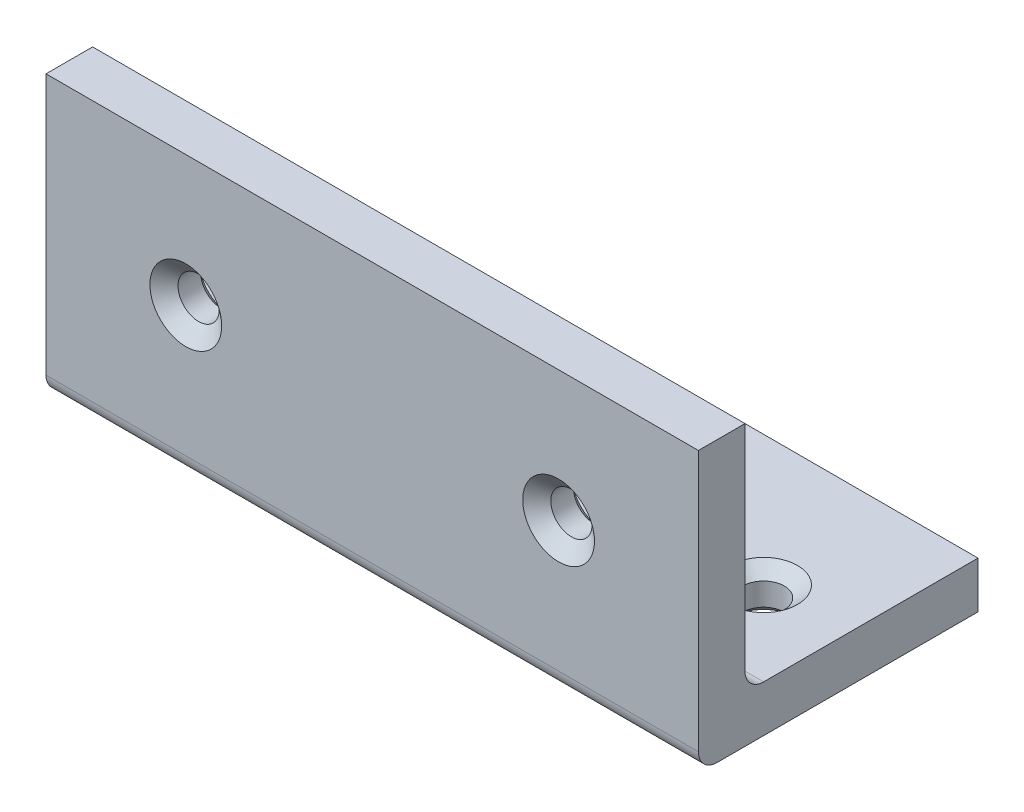
ISO-10303-21;
HEADER;
FILE_DESCRIPTION(('STEP AP214'),'2;1');
FILE_NAME('part.step','',(''),(''),'','','');
FILE_SCHEMA(('AUTOMOTIVE_DESIGN { 1 0 10303 214 1 1 1 1 }'));
ENDSEC;
DATA;
#1=APPLICATION_CONTEXT('core data for automotive mechanical design processes');
#2=APPLICATION_PROTOCOL_DEFINITION('international standard','automotive_design',2000,#1);
#3=PRODUCT_CONTEXT('',#1,'mechanical');
#4=PRODUCT('Part','Part','',(#3));
#5=PRODUCT_RELATED_PRODUCT_CATEGORY('part','',(#4));
#6=PRODUCT_DEFINITION_FORMATION('','',#4);
#7=PRODUCT_DEFINITION_CONTEXT('part definition',#1,'design');
#8=PRODUCT_DEFINITION('design','',#6,#7);
#9=PRODUCT_DEFINITION_SHAPE('','',#8);
#10=(LENGTH_UNIT() NAMED_UNIT(*) SI_UNIT(.MILLI.,.METRE.));
#11=(NAMED_UNIT(*) PLANE_ANGLE_UNIT() SI_UNIT($,.RADIAN.));
#12=(NAMED_UNIT(*) SI_UNIT($,.STERADIAN.) SOLID_ANGLE_UNIT());
#13=UNCERTAINTY_MEASURE_WITH_UNIT(LENGTH_MEASURE(1.E-05),#10,'distance_accuracy_value','');
#14=(GEOMETRIC_REPRESENTATION_CONTEXT(3) GLOBAL_UNCERTAINTY_ASSIGNED_CONTEXT((#13)) GLOBAL_UNIT_ASSIGNED_CONTEXT((#10,
#11,#12)) REPRESENTATION_CONTEXT('',''));
#15=CARTESIAN_POINT('',(0.,0.,0.));
#16=DIRECTION('',(0.,0.,1.));
#17=DIRECTION('',(1.,0.,0.));
#18=AXIS2_PLACEMENT_3D('',#15,#16,#17);
#19=CARTESIAN_POINT('',(0.,6.35,0.));
#20=DIRECTION('',(0.,-1.,0.));
#21=DIRECTION('',(0.,0.,-1.));
#22=AXIS2_PLACEMENT_3D('',#19,#20,#21);
#23=PLANE('',#22);
#24=CARTESIAN_POINT('',(33.02,6.35,-1.27000000000001));
#25=DIRECTION('',(0.,-1.,0.));
#26=DIRECTION('',(0.,0.,-1.));
#27=AXIS2_PLACEMENT_3D('',#24,#25,#26);
#28=CIRCLE('',#27,4.6101);
#29=CARTESIAN_POINT('',(33.02,6.35,-5.8801));
#30=VERTEX_POINT('',#29);
#31=EDGE_CURVE('E420',#30,#30,#28,.T.);
#32=ORIENTED_EDGE('',*,*,#31,.T.);
#33=EDGE_LOOP('',(#32));
#34=FACE_BOUND('',#33,.T.);
#35=CARTESIAN_POINT('',(-33.02,6.35,-1.27));
#36=DIRECTION('',(0.,-1.,0.));
#37=DIRECTION('',(0.,0.,-1.));
#38=AXIS2_PLACEMENT_3D('',#35,#36,#37);
#39=CIRCLE('',#38,4.6101);
#40=CARTESIAN_POINT('',(-33.02,6.35,-5.88009999999999));
#41=VERTEX_POINT('',#40);
#42=EDGE_CURVE('E431',#41,#41,#39,.T.);
#43=ORIENTED_EDGE('',*,*,#42,.T.);
#44=EDGE_LOOP('',(#43));
#45=FACE_BOUND('',#44,.T.);
#46=CARTESIAN_POINT('',(0.,6.35,-1.27));
#47=DIRECTION('',(0.,1.,0.));
#48=DIRECTION('',(0.,0.,1.));
#49=AXIS2_PLACEMENT_3D('',#46,#47,#48);
#50=CIRCLE('',#49,4.8895);
#51=CARTESIAN_POINT('',(0.,6.35,3.6195));
#52=VERTEX_POINT('',#51);
#53=EDGE_CURVE('E446',#52,#52,#50,.T.);
#54=ORIENTED_EDGE('',*,*,#53,.F.);
#55=EDGE_LOOP('',(#54));
#56=FACE_BOUND('',#55,.T.);
#57=DIRECTION('',(0.,0.,1.));
#58=VECTOR('',#57,1.);
#59=CARTESIAN_POINT('',(-44.45,6.35,19.05));
#60=LINE('',#59,#58);
#61=CARTESIAN_POINT('',(-44.45,6.35,-19.05));
#62=VERTEX_POINT('',#61);
#63=CARTESIAN_POINT('',(-44.45,6.35,10.16));
#64=VERTEX_POINT('',#63);
#65=EDGE_CURVE('E118',#62,#64,#60,.T.);
#66=ORIENTED_EDGE('',*,*,#65,.T.);
#67=DIRECTION('',(-1.,0.,0.));
#68=VECTOR('',#67,1.);
#69=CARTESIAN_POINT('',(44.45,6.35,10.16));
#70=LINE('',#69,#68);
#71=CARTESIAN_POINT('',(44.45,6.35,10.16));
#72=VERTEX_POINT('',#71);
#73=EDGE_CURVE('E167',#64,#72,#70,.F.);
#74=ORIENTED_EDGE('',*,*,#73,.T.);
#75=DIRECTION('',(0.,0.,-1.));
#76=VECTOR('',#75,1.);
#77=CARTESIAN_POINT('',(44.45,6.35,19.05));
#78=LINE('',#77,#76);
#79=CARTESIAN_POINT('',(44.45,6.35,-19.05));
#80=VERTEX_POINT('',#79);
#81=EDGE_CURVE('E147',#72,#80,#78,.T.);
#82=ORIENTED_EDGE('',*,*,#81,.T.);
#83=DIRECTION('',(-1.,0.,0.));
#84=VECTOR('',#83,1.);
#85=CARTESIAN_POINT('',(44.45,6.35,-19.05));
#86=LINE('',#85,#84);
#87=EDGE_CURVE('E149',#80,#62,#86,.T.);
#88=ORIENTED_EDGE('',*,*,#87,.T.);
#89=EDGE_LOOP('',(#66,#74,#82,#88));
#90=FACE_BOUND('',#89,.T.);
#91=ADVANCED_FACE('F43',(#34,#45,#56,#90),#23,.F.);
#92=CARTESIAN_POINT('',(44.45,6.35,19.05));
#93=DIRECTION('',(0.,0.,-1.));
#94=DIRECTION('',(-1.,0.,0.));
#95=AXIS2_PLACEMENT_3D('',#92,#93,#94);
#96=PLANE('',#95);
#97=CARTESIAN_POINT('',(-25.4,20.32,19.05));
#98=DIRECTION('',(0.,0.,1.));
#99=DIRECTION('',(1.,0.,0.));
#100=AXIS2_PLACEMENT_3D('',#97,#98,#99);
#101=CIRCLE('',#100,4.8895);
#102=CARTESIAN_POINT('',(-20.5105,20.32,19.05));
#103=VERTEX_POINT('',#102);
#104=EDGE_CURVE('E398',#103,#103,#101,.T.);
#105=ORIENTED_EDGE('',*,*,#104,.F.);
#106=EDGE_LOOP('',(#105));
#107=FACE_BOUND('',#106,.T.);
#108=CARTESIAN_POINT('',(25.4,20.32,19.05));
#109=DIRECTION('',(0.,0.,1.));
#110=DIRECTION('',(1.,0.,0.));
#111=AXIS2_PLACEMENT_3D('',#108,#109,#110);
#112=CIRCLE('',#111,4.8895);
#113=CARTESIAN_POINT('',(30.2895,20.32,19.05));
#114=VERTEX_POINT('',#113);
#115=EDGE_CURVE('E411',#114,#114,#112,.T.);
#116=ORIENTED_EDGE('',*,*,#115,.F.);
#117=EDGE_LOOP('',(#116));
#118=FACE_BOUND('',#117,.T.);
#119=DIRECTION('',(0.,-1.,0.));
#120=VECTOR('',#119,1.);
#121=CARTESIAN_POINT('',(-44.45,6.35,19.05));
#122=LINE('',#121,#120);
#123=CARTESIAN_POINT('',(-44.45,38.1,19.05));
#124=VERTEX_POINT('',#123);
#125=CARTESIAN_POINT('',(-44.45,2.54,19.05));
#126=VERTEX_POINT('',#125);
#127=EDGE_CURVE('E107',#124,#126,#122,.T.);
#128=ORIENTED_EDGE('',*,*,#127,.T.);
#129=DIRECTION('',(1.,0.,0.));
#130=VECTOR('',#129,1.);
#131=CARTESIAN_POINT('',(44.45,2.54,19.05));
#132=LINE('',#131,#130);
#133=CARTESIAN_POINT('',(44.45,2.54,19.05));
#134=VERTEX_POINT('',#133);
#135=EDGE_CURVE('E173',#126,#134,#132,.T.);
#136=ORIENTED_EDGE('',*,*,#135,.T.);
#137=DIRECTION('',(0.,-1.,0.));
#138=VECTOR('',#137,1.);
#139=CARTESIAN_POINT('',(44.45,6.35,19.05));
#140=LINE('',#139,#138);
#141=CARTESIAN_POINT('',(44.45,38.1,19.05));
#142=VERTEX_POINT('',#141);
#143=EDGE_CURVE('E123',#142,#134,#140,.T.);
#144=ORIENTED_EDGE('',*,*,#143,.F.);
#145=DIRECTION('',(1.,0.,0.));
#146=VECTOR('',#145,1.);
#147=CARTESIAN_POINT('',(-44.45,38.1,19.05));
#148=LINE('',#147,#146);
#149=EDGE_CURVE('E121',#124,#142,#148,.T.);
#150=ORIENTED_EDGE('',*,*,#149,.F.);
#151=EDGE_LOOP('',(#128,#136,#144,#150));
#152=FACE_BOUND('',#151,.T.);
#153=ADVANCED_FACE('F122',(#107,#118,#152),#96,.F.);
#154=CARTESIAN_POINT('',(44.45,6.35,19.05));
#155=DIRECTION('',(-1.,0.,0.));
#156=DIRECTION('',(0.,0.,1.));
#157=AXIS2_PLACEMENT_3D('',#154,#155,#156);
#158=PLANE('',#157);
#159=ORIENTED_EDGE('',*,*,#143,.T.);
#160=CARTESIAN_POINT('',(44.45,2.54,16.51));
#161=DIRECTION('',(-1.,0.,0.));
#162=DIRECTION('',(0.,0.,1.));
#163=AXIS2_PLACEMENT_3D('',#160,#161,#162);
#164=CIRCLE('',#163,2.54);
#165=CARTESIAN_POINT('',(44.45,0.,16.51));
#166=VERTEX_POINT('',#165);
#167=EDGE_CURVE('E65',#134,#166,#164,.F.);
#168=ORIENTED_EDGE('',*,*,#167,.T.);
#169=DIRECTION('',(0.,0.,-1.));
#170=VECTOR('',#169,1.);
#171=CARTESIAN_POINT('',(44.45,0.,19.05));
#172=LINE('',#171,#170);
#173=CARTESIAN_POINT('',(44.45,0.,-19.05));
#174=VERTEX_POINT('',#173);
#175=EDGE_CURVE('E146',#166,#174,#172,.T.);
#176=ORIENTED_EDGE('',*,*,#175,.T.);
#177=DIRECTION('',(0.,-1.,0.));
#178=VECTOR('',#177,1.);
#179=CARTESIAN_POINT('',(44.45,6.35,-19.05));
#180=LINE('',#179,#178);
#181=EDGE_CURVE('E160',#80,#174,#180,.T.);
#182=ORIENTED_EDGE('',*,*,#181,.F.);
#183=ORIENTED_EDGE('',*,*,#81,.F.);
#184=CARTESIAN_POINT('',(44.45,8.89,10.16));
#185=DIRECTION('',(-1.,0.,0.));
#186=DIRECTION('',(0.,0.,1.));
#187=AXIS2_PLACEMENT_3D('',#184,#185,#186);
#188=CIRCLE('',#187,2.54);
#189=CARTESIAN_POINT('',(44.45,8.89,12.7));
#190=VERTEX_POINT('',#189);
#191=EDGE_CURVE('E171',#72,#190,#188,.T.);
#192=ORIENTED_EDGE('',*,*,#191,.T.);
#193=DIRECTION('',(0.,-1.,0.));
#194=VECTOR('',#193,1.);
#195=CARTESIAN_POINT('',(44.45,38.1,12.7));
#196=LINE('',#195,#194);
#197=CARTESIAN_POINT('',(44.45,38.1,12.7));
#198=VERTEX_POINT('',#197);
#199=EDGE_CURVE('E143',#198,#190,#196,.T.);
#200=ORIENTED_EDGE('',*,*,#199,.F.);
#201=DIRECTION('',(0.,0.,-1.));
#202=VECTOR('',#201,1.);
#203=CARTESIAN_POINT('',(44.45,38.1,19.05));
#204=LINE('',#203,#202);
#205=EDGE_CURVE('E126',#142,#198,#204,.T.);
#206=ORIENTED_EDGE('',*,*,#205,.F.);
#207=EDGE_LOOP('',(#159,#168,#176,#182,#183,#192,#200,#206));
#208=FACE_BOUND('',#207,.T.);
#209=ADVANCED_FACE('F176',(#208),#158,.F.);
#210=CARTESIAN_POINT('',(44.45,6.35,-19.05));
#211=DIRECTION('',(0.,0.,1.));
#212=DIRECTION('',(1.,0.,0.));
#213=AXIS2_PLACEMENT_3D('',#210,#211,#212);
#214=PLANE('',#213);
#215=DIRECTION('',(-1.,0.,0.));
#216=VECTOR('',#215,1.);
#217=CARTESIAN_POINT('',(44.45,0.,-19.05));
#218=LINE('',#217,#216);
#219=CARTESIAN_POINT('',(-44.45,0.,-19.05));
#220=VERTEX_POINT('',#219);
#221=EDGE_CURVE('E155',#174,#220,#218,.T.);
#222=ORIENTED_EDGE('',*,*,#221,.T.);
#223=DIRECTION('',(0.,-1.,0.));
#224=VECTOR('',#223,1.);
#225=CARTESIAN_POINT('',(-44.45,6.35,-19.05));
#226=LINE('',#225,#224);
#227=EDGE_CURVE('E117',#62,#220,#226,.T.);
#228=ORIENTED_EDGE('',*,*,#227,.F.);
#229=ORIENTED_EDGE('',*,*,#87,.F.);
#230=ORIENTED_EDGE('',*,*,#181,.T.);
#231=EDGE_LOOP('',(#222,#228,#229,#230));
#232=FACE_BOUND('',#231,.T.);
#233=ADVANCED_FACE('F216',(#232),#214,.F.);
#234=CARTESIAN_POINT('',(-44.45,6.35,19.05));
#235=DIRECTION('',(1.,0.,0.));
#236=DIRECTION('',(0.,0.,-1.));
#237=AXIS2_PLACEMENT_3D('',#234,#235,#236);
#238=PLANE('',#237);
#239=DIRECTION('',(0.,0.,1.));
#240=VECTOR('',#239,1.);
#241=CARTESIAN_POINT('',(-44.45,0.,19.05));
#242=LINE('',#241,#240);
#243=CARTESIAN_POINT('',(-44.45,0.,16.51));
#244=VERTEX_POINT('',#243);
#245=EDGE_CURVE('E150',#220,#244,#242,.T.);
#246=ORIENTED_EDGE('',*,*,#245,.T.);
#247=CARTESIAN_POINT('',(-44.45,2.54,16.51));
#248=DIRECTION('',(1.,0.,0.));
#249=DIRECTION('',(0.,0.,-1.));
#250=AXIS2_PLACEMENT_3D('',#247,#248,#249);
#251=CIRCLE('',#250,2.54);
#252=EDGE_CURVE('E11',#244,#126,#251,.F.);
#253=ORIENTED_EDGE('',*,*,#252,.T.);
#254=ORIENTED_EDGE('',*,*,#127,.F.);
#255=DIRECTION('',(0.,0.,1.));
#256=VECTOR('',#255,1.);
#257=CARTESIAN_POINT('',(-44.45,38.1,19.05));
#258=LINE('',#257,#256);
#259=CARTESIAN_POINT('',(-44.45,38.1,12.7));
#260=VERTEX_POINT('',#259);
#261=EDGE_CURVE('E112',#260,#124,#258,.T.);
#262=ORIENTED_EDGE('',*,*,#261,.F.);
#263=DIRECTION('',(0.,-1.,0.));
#264=VECTOR('',#263,1.);
#265=CARTESIAN_POINT('',(-44.45,38.1,12.7));
#266=LINE('',#265,#264);
#267=CARTESIAN_POINT('',(-44.45,8.89,12.7));
#268=VERTEX_POINT('',#267);
#269=EDGE_CURVE('E141',#260,#268,#266,.T.);
#270=ORIENTED_EDGE('',*,*,#269,.T.);
#271=CARTESIAN_POINT('',(-44.45,8.89,10.16));
#272=DIRECTION('',(1.,0.,0.));
#273=DIRECTION('',(0.,0.,-1.));
#274=AXIS2_PLACEMENT_3D('',#271,#272,#273);
#275=CIRCLE('',#274,2.54);
#276=EDGE_CURVE('E169',#268,#64,#275,.T.);
#277=ORIENTED_EDGE('',*,*,#276,.T.);
#278=ORIENTED_EDGE('',*,*,#65,.F.);
#279=ORIENTED_EDGE('',*,*,#227,.T.);
#280=EDGE_LOOP('',(#246,#253,#254,#262,#270,#277,#278,#279));
#281=FACE_BOUND('',#280,.T.);
#282=ADVANCED_FACE('F109',(#281),#238,.F.);
#283=CARTESIAN_POINT('',(0.,0.,0.));
#284=DIRECTION('',(0.,-1.,0.));
#285=DIRECTION('',(0.,0.,-1.));
#286=AXIS2_PLACEMENT_3D('',#283,#284,#285);
#287=PLANE('',#286);
#288=CARTESIAN_POINT('',(33.02,0.,-1.27000000000001));
#289=DIRECTION('',(0.,-1.,0.));
#290=DIRECTION('',(0.,0.,-1.));
#291=AXIS2_PLACEMENT_3D('',#288,#289,#290);
#292=CIRCLE('',#291,4.8895);
#293=CARTESIAN_POINT('',(33.02,0.,-6.1595));
#294=VERTEX_POINT('',#293);
#295=EDGE_CURVE('E422',#294,#294,#292,.T.);
#296=ORIENTED_EDGE('',*,*,#295,.F.);
#297=EDGE_LOOP('',(#296));
#298=FACE_BOUND('',#297,.T.);
#299=CARTESIAN_POINT('',(-33.02,0.,-1.27));
#300=DIRECTION('',(0.,-1.,0.));
#301=DIRECTION('',(0.,0.,-1.));
#302=AXIS2_PLACEMENT_3D('',#299,#300,#301);
#303=CIRCLE('',#302,4.8895);
#304=CARTESIAN_POINT('',(-33.02,0.,-6.15949999999999));
#305=VERTEX_POINT('',#304);
#306=EDGE_CURVE('E434',#305,#305,#303,.T.);
#307=ORIENTED_EDGE('',*,*,#306,.F.);
#308=EDGE_LOOP('',(#307));
#309=FACE_BOUND('',#308,.T.);
#310=CARTESIAN_POINT('',(0.,0.,-1.27));
#311=DIRECTION('',(0.,1.,0.));
#312=DIRECTION('',(0.,0.,1.));
#313=AXIS2_PLACEMENT_3D('',#310,#311,#312);
#314=CIRCLE('',#313,4.6101);
#315=CARTESIAN_POINT('',(0.,0.,3.3401));
#316=VERTEX_POINT('',#315);
#317=EDGE_CURVE('E443',#316,#316,#314,.T.);
#318=ORIENTED_EDGE('',*,*,#317,.T.);
#319=EDGE_LOOP('',(#318));
#320=FACE_BOUND('',#319,.T.);
#321=ORIENTED_EDGE('',*,*,#175,.F.);
#322=DIRECTION('',(1.,0.,0.));
#323=VECTOR('',#322,1.);
#324=CARTESIAN_POINT('',(-44.45,0.,16.51));
#325=LINE('',#324,#323);
#326=EDGE_CURVE('E51',#166,#244,#325,.F.);
#327=ORIENTED_EDGE('',*,*,#326,.T.);
#328=ORIENTED_EDGE('',*,*,#245,.F.);
#329=ORIENTED_EDGE('',*,*,#221,.F.);
#330=EDGE_LOOP('',(#321,#327,#328,#329));
#331=FACE_BOUND('',#330,.T.);
#332=ADVANCED_FACE('F210',(#298,#309,#320,#331),#287,.T.);
#333=CARTESIAN_POINT('',(-44.45,38.1,12.7));
#334=DIRECTION('',(0.,0.,1.));
#335=DIRECTION('',(1.,0.,0.));
#336=AXIS2_PLACEMENT_3D('',#333,#334,#335);
#337=PLANE('',#336);
#338=CARTESIAN_POINT('',(-25.4,20.32,12.7));
#339=DIRECTION('',(0.,0.,1.));
#340=DIRECTION('',(1.,0.,0.));
#341=AXIS2_PLACEMENT_3D('',#338,#339,#340);
#342=CIRCLE('',#341,4.6101);
#343=CARTESIAN_POINT('',(-20.7899,20.32,12.7));
#344=VERTEX_POINT('',#343);
#345=EDGE_CURVE('E399',#344,#344,#342,.T.);
#346=ORIENTED_EDGE('',*,*,#345,.T.);
#347=EDGE_LOOP('',(#346));
#348=FACE_BOUND('',#347,.T.);
#349=CARTESIAN_POINT('',(25.4,20.32,12.7));
#350=DIRECTION('',(0.,0.,1.));
#351=DIRECTION('',(1.,0.,0.));
#352=AXIS2_PLACEMENT_3D('',#349,#350,#351);
#353=CIRCLE('',#352,4.6101);
#354=CARTESIAN_POINT('',(30.0101,20.32,12.7));
#355=VERTEX_POINT('',#354);
#356=EDGE_CURVE('E408',#355,#355,#353,.T.);
#357=ORIENTED_EDGE('',*,*,#356,.T.);
#358=EDGE_LOOP('',(#357));
#359=FACE_BOUND('',#358,.T.);
#360=ORIENTED_EDGE('',*,*,#199,.T.);
#361=DIRECTION('',(-1.,0.,0.));
#362=VECTOR('',#361,1.);
#363=CARTESIAN_POINT('',(-44.45,8.89,12.7));
#364=LINE('',#363,#362);
#365=EDGE_CURVE('E164',#190,#268,#364,.T.);
#366=ORIENTED_EDGE('',*,*,#365,.T.);
#367=ORIENTED_EDGE('',*,*,#269,.F.);
#368=DIRECTION('',(-1.,0.,0.));
#369=VECTOR('',#368,1.);
#370=CARTESIAN_POINT('',(-44.45,38.1,12.7));
#371=LINE('',#370,#369);
#372=EDGE_CURVE('E130',#198,#260,#371,.T.);
#373=ORIENTED_EDGE('',*,*,#372,.F.);
#374=EDGE_LOOP('',(#360,#366,#367,#373));
#375=FACE_BOUND('',#374,.T.);
#376=ADVANCED_FACE('F182',(#348,#359,#375),#337,.F.);
#377=CARTESIAN_POINT('',(0.,38.1,0.));
#378=DIRECTION('',(0.,-1.,0.));
#379=DIRECTION('',(0.,0.,-1.));
#380=AXIS2_PLACEMENT_3D('',#377,#378,#379);
#381=PLANE('',#380);
#382=ORIENTED_EDGE('',*,*,#261,.T.);
#383=ORIENTED_EDGE('',*,*,#149,.T.);
#384=ORIENTED_EDGE('',*,*,#205,.T.);
#385=ORIENTED_EDGE('',*,*,#372,.T.);
#386=EDGE_LOOP('',(#382,#383,#384,#385));
#387=FACE_BOUND('',#386,.T.);
#388=ADVANCED_FACE('F128',(#387),#381,.F.);
#389=CARTESIAN_POINT('',(-44.45,8.89,10.16));
#390=DIRECTION('',(1.,0.,0.));
#391=DIRECTION('',(0.,0.,-1.));
#392=AXIS2_PLACEMENT_3D('',#389,#390,#391);
#393=CYLINDRICAL_SURFACE('',#392,2.54);
#394=ORIENTED_EDGE('',*,*,#191,.F.);
#395=ORIENTED_EDGE('',*,*,#73,.F.);
#396=ORIENTED_EDGE('',*,*,#276,.F.);
#397=ORIENTED_EDGE('',*,*,#365,.F.);
#398=EDGE_LOOP('',(#394,#395,#396,#397));
#399=FACE_BOUND('',#398,.T.);
#400=ADVANCED_FACE('F189',(#399),#393,.F.);
#401=CARTESIAN_POINT('',(44.45,2.54,16.51));
#402=DIRECTION('',(-1.,0.,0.));
#403=DIRECTION('',(0.,0.,1.));
#404=AXIS2_PLACEMENT_3D('',#401,#402,#403);
#405=CYLINDRICAL_SURFACE('',#404,2.54);
#406=ORIENTED_EDGE('',*,*,#252,.F.);
#407=ORIENTED_EDGE('',*,*,#326,.F.);
#408=ORIENTED_EDGE('',*,*,#167,.F.);
#409=ORIENTED_EDGE('',*,*,#135,.F.);
#410=EDGE_LOOP('',(#406,#407,#408,#409));
#411=FACE_BOUND('',#410,.T.);
#412=ADVANCED_FACE('F45',(#411),#405,.T.);
#413=CARTESIAN_POINT('',(0.,1.5132322748651,-1.27));
#414=DIRECTION('',(0.,-1.,0.));
#415=DIRECTION('',(0.,0.,-1.));
#416=AXIS2_PLACEMENT_3D('',#413,#414,#415);
#417=CONICAL_SURFACE('',#416,2.8067,0.872664625997165);
#418=ORIENTED_EDGE('',*,*,#317,.F.);
#419=EDGE_LOOP('',(#418));
#420=FACE_BOUND('',#419,.T.);
#421=CARTESIAN_POINT('',(0.,1.5132322748651,-1.27));
#422=DIRECTION('',(0.,1.,0.));
#423=DIRECTION('',(0.,0.,1.));
#424=AXIS2_PLACEMENT_3D('',#421,#422,#423);
#425=CIRCLE('',#424,2.8067);
#426=CARTESIAN_POINT('',(0.,1.5132322748651,1.5367));
#427=VERTEX_POINT('',#426);
#428=EDGE_CURVE('E132',#427,#427,#425,.T.);
#429=ORIENTED_EDGE('',*,*,#428,.T.);
#430=EDGE_LOOP('',(#429));
#431=FACE_BOUND('',#430,.T.);
#432=ADVANCED_FACE('F196',(#420,#431),#417,.F.);
#433=CARTESIAN_POINT('',(0.,6.35,-1.27));
#434=DIRECTION('',(0.,1.,0.));
#435=DIRECTION('',(0.,0.,1.));
#436=AXIS2_PLACEMENT_3D('',#433,#434,#435);
#437=CYLINDRICAL_SURFACE('',#436,2.8067);
#438=ORIENTED_EDGE('',*,*,#428,.F.);
#439=EDGE_LOOP('',(#438));
#440=FACE_BOUND('',#439,.T.);
#441=CARTESIAN_POINT('',(0.,4.60232328818395,-1.27));
#442=DIRECTION('',(0.,1.,0.));
#443=DIRECTION('',(0.,0.,1.));
#444=AXIS2_PLACEMENT_3D('',#441,#442,#443);
#445=CIRCLE('',#444,2.8067);
#446=CARTESIAN_POINT('',(0.,4.60232328818395,1.5367));
#447=VERTEX_POINT('',#446);
#448=EDGE_CURVE('E135',#447,#447,#445,.T.);
#449=ORIENTED_EDGE('',*,*,#448,.T.);
#450=EDGE_LOOP('',(#449));
#451=FACE_BOUND('',#450,.T.);
#452=ADVANCED_FACE('F248',(#440,#451),#437,.F.);
#453=CARTESIAN_POINT('',(0.,6.35,-1.27));
#454=DIRECTION('',(0.,1.,0.));
#455=DIRECTION('',(0.,0.,1.));
#456=AXIS2_PLACEMENT_3D('',#453,#454,#455);
#457=CONICAL_SURFACE('',#456,4.8895,0.872664625997163);
#458=ORIENTED_EDGE('',*,*,#448,.F.);
#459=EDGE_LOOP('',(#458));
#460=FACE_BOUND('',#459,.T.);
#461=ORIENTED_EDGE('',*,*,#53,.T.);
#462=EDGE_LOOP('',(#461));
#463=FACE_BOUND('',#462,.T.);
#464=ADVANCED_FACE('F259',(#460,#463),#457,.F.);
#465=CARTESIAN_POINT('',(-33.02,4.8367677251349,-1.27));
#466=DIRECTION('',(0.,1.,0.));
#467=DIRECTION('',(0.,0.,1.));
#468=AXIS2_PLACEMENT_3D('',#465,#466,#467);
#469=CONICAL_SURFACE('',#468,2.8067,0.872664625997165);
#470=ORIENTED_EDGE('',*,*,#42,.F.);
#471=EDGE_LOOP('',(#470));
#472=FACE_BOUND('',#471,.T.);
#473=CARTESIAN_POINT('',(-33.02,4.8367677251349,-1.27));
#474=DIRECTION('',(0.,-1.,0.));
#475=DIRECTION('',(0.,0.,-1.));
#476=AXIS2_PLACEMENT_3D('',#473,#474,#475);
#477=CIRCLE('',#476,2.8067);
#478=CARTESIAN_POINT('',(-33.02,4.8367677251349,-4.07669999999999));
#479=VERTEX_POINT('',#478);
#480=EDGE_CURVE('E440',#479,#479,#477,.T.);
#481=ORIENTED_EDGE('',*,*,#480,.T.);
#482=EDGE_LOOP('',(#481));
#483=FACE_BOUND('',#482,.T.);
#484=ADVANCED_FACE('F269',(#472,#483),#469,.F.);
#485=CARTESIAN_POINT('',(-33.02,0.,-1.27));
#486=DIRECTION('',(0.,-1.,0.));
#487=DIRECTION('',(0.,0.,-1.));
#488=AXIS2_PLACEMENT_3D('',#485,#486,#487);
#489=CYLINDRICAL_SURFACE('',#488,2.8067);
#490=ORIENTED_EDGE('',*,*,#480,.F.);
#491=EDGE_LOOP('',(#490));
#492=FACE_BOUND('',#491,.T.);
#493=CARTESIAN_POINT('',(-33.02,1.74767671181604,-1.27));
#494=DIRECTION('',(0.,-1.,0.));
#495=DIRECTION('',(0.,0.,-1.));
#496=AXIS2_PLACEMENT_3D('',#493,#494,#495);
#497=CIRCLE('',#496,2.8067);
#498=CARTESIAN_POINT('',(-33.02,1.74767671181604,-4.07669999999999));
#499=VERTEX_POINT('',#498);
#500=EDGE_CURVE('E437',#499,#499,#497,.T.);
#501=ORIENTED_EDGE('',*,*,#500,.T.);
#502=EDGE_LOOP('',(#501));
#503=FACE_BOUND('',#502,.T.);
#504=ADVANCED_FACE('F279',(#492,#503),#489,.F.);
#505=CARTESIAN_POINT('',(-33.02,0.,-1.27));
#506=DIRECTION('',(0.,-1.,0.));
#507=DIRECTION('',(0.,0.,-1.));
#508=AXIS2_PLACEMENT_3D('',#505,#506,#507);
#509=CONICAL_SURFACE('',#508,4.8895,0.872664625997163);
#510=ORIENTED_EDGE('',*,*,#500,.F.);
#511=EDGE_LOOP('',(#510));
#512=FACE_BOUND('',#511,.T.);
#513=ORIENTED_EDGE('',*,*,#306,.T.);
#514=EDGE_LOOP('',(#513));
#515=FACE_BOUND('',#514,.T.);
#516=ADVANCED_FACE('F289',(#512,#515),#509,.F.);
#517=CARTESIAN_POINT('',(33.02,4.8367677251349,-1.27000000000001));
#518=DIRECTION('',(0.,1.,0.));
#519=DIRECTION('',(0.,0.,1.));
#520=AXIS2_PLACEMENT_3D('',#517,#518,#519);
#521=CONICAL_SURFACE('',#520,2.8067,0.872664625997166);
#522=ORIENTED_EDGE('',*,*,#31,.F.);
#523=EDGE_LOOP('',(#522));
#524=FACE_BOUND('',#523,.T.);
#525=CARTESIAN_POINT('',(33.02,4.8367677251349,-1.27000000000001));
#526=DIRECTION('',(0.,-1.,0.));
#527=DIRECTION('',(0.,0.,-1.));
#528=AXIS2_PLACEMENT_3D('',#525,#526,#527);
#529=CIRCLE('',#528,2.8067);
#530=CARTESIAN_POINT('',(33.02,4.8367677251349,-4.0767));
#531=VERTEX_POINT('',#530);
#532=EDGE_CURVE('E428',#531,#531,#529,.T.);
#533=ORIENTED_EDGE('',*,*,#532,.T.);
#534=EDGE_LOOP('',(#533));
#535=FACE_BOUND('',#534,.T.);
#536=ADVANCED_FACE('F299',(#524,#535),#521,.F.);
#537=CARTESIAN_POINT('',(33.02,0.,-1.27000000000001));
#538=DIRECTION('',(0.,-1.,0.));
#539=DIRECTION('',(0.,0.,-1.));
#540=AXIS2_PLACEMENT_3D('',#537,#538,#539);
#541=CYLINDRICAL_SURFACE('',#540,2.8067);
#542=ORIENTED_EDGE('',*,*,#532,.F.);
#543=EDGE_LOOP('',(#542));
#544=FACE_BOUND('',#543,.T.);
#545=CARTESIAN_POINT('',(33.02,1.74767671181604,-1.27000000000001));
#546=DIRECTION('',(0.,-1.,0.));
#547=DIRECTION('',(0.,0.,-1.));
#548=AXIS2_PLACEMENT_3D('',#545,#546,#547);
#549=CIRCLE('',#548,2.8067);
#550=CARTESIAN_POINT('',(33.02,1.74767671181604,-4.0767));
#551=VERTEX_POINT('',#550);
#552=EDGE_CURVE('E425',#551,#551,#549,.T.);
#553=ORIENTED_EDGE('',*,*,#552,.T.);
#554=EDGE_LOOP('',(#553));
#555=FACE_BOUND('',#554,.T.);
#556=ADVANCED_FACE('F309',(#544,#555),#541,.F.);
#557=CARTESIAN_POINT('',(33.02,0.,-1.27000000000001));
#558=DIRECTION('',(0.,-1.,0.));
#559=DIRECTION('',(0.,0.,-1.));
#560=AXIS2_PLACEMENT_3D('',#557,#558,#559);
#561=CONICAL_SURFACE('',#560,4.8895,0.872664625997163);
#562=ORIENTED_EDGE('',*,*,#552,.F.);
#563=EDGE_LOOP('',(#562));
#564=FACE_BOUND('',#563,.T.);
#565=ORIENTED_EDGE('',*,*,#295,.T.);
#566=EDGE_LOOP('',(#565));
#567=FACE_BOUND('',#566,.T.);
#568=ADVANCED_FACE('F319',(#564,#567),#561,.F.);
#569=CARTESIAN_POINT('',(25.4,20.32,14.2132322748651));
#570=DIRECTION('',(0.,0.,-1.));
#571=DIRECTION('',(-1.,0.,0.));
#572=AXIS2_PLACEMENT_3D('',#569,#570,#571);
#573=CONICAL_SURFACE('',#572,2.8067,0.872664625997164);
#574=ORIENTED_EDGE('',*,*,#356,.F.);
#575=EDGE_LOOP('',(#574));
#576=FACE_BOUND('',#575,.T.);
#577=CARTESIAN_POINT('',(25.4,20.32,14.2132322748651));
#578=DIRECTION('',(0.,0.,1.));
#579=DIRECTION('',(1.,0.,0.));
#580=AXIS2_PLACEMENT_3D('',#577,#578,#579);
#581=CIRCLE('',#580,2.8067);
#582=CARTESIAN_POINT('',(28.2067,20.32,14.2132322748651));
#583=VERTEX_POINT('',#582);
#584=EDGE_CURVE('E417',#583,#583,#581,.T.);
#585=ORIENTED_EDGE('',*,*,#584,.T.);
#586=EDGE_LOOP('',(#585));
#587=FACE_BOUND('',#586,.T.);
#588=ADVANCED_FACE('F329',(#576,#587),#573,.F.);
#589=CARTESIAN_POINT('',(25.4,20.32,19.05));
#590=DIRECTION('',(0.,0.,1.));
#591=DIRECTION('',(1.,0.,0.));
#592=AXIS2_PLACEMENT_3D('',#589,#590,#591);
#593=CYLINDRICAL_SURFACE('',#592,2.8067);
#594=ORIENTED_EDGE('',*,*,#584,.F.);
#595=EDGE_LOOP('',(#594));
#596=FACE_BOUND('',#595,.T.);
#597=CARTESIAN_POINT('',(25.4,20.32,17.302323288184));
#598=DIRECTION('',(0.,0.,1.));
#599=DIRECTION('',(1.,0.,0.));
#600=AXIS2_PLACEMENT_3D('',#597,#598,#599);
#601=CIRCLE('',#600,2.8067);
#602=CARTESIAN_POINT('',(28.2067,20.32,17.302323288184));
#603=VERTEX_POINT('',#602);
#604=EDGE_CURVE('E414',#603,#603,#601,.T.);
#605=ORIENTED_EDGE('',*,*,#604,.T.);
#606=EDGE_LOOP('',(#605));
#607=FACE_BOUND('',#606,.T.);
#608=ADVANCED_FACE('F339',(#596,#607),#593,.F.);
#609=CARTESIAN_POINT('',(25.4,20.32,19.05));
#610=DIRECTION('',(0.,0.,1.));
#611=DIRECTION('',(1.,0.,0.));
#612=AXIS2_PLACEMENT_3D('',#609,#610,#611);
#613=CONICAL_SURFACE('',#612,4.8895,0.872664625997163);
#614=ORIENTED_EDGE('',*,*,#604,.F.);
#615=EDGE_LOOP('',(#614));
#616=FACE_BOUND('',#615,.T.);
#617=ORIENTED_EDGE('',*,*,#115,.T.);
#618=EDGE_LOOP('',(#617));
#619=FACE_BOUND('',#618,.T.);
#620=ADVANCED_FACE('F349',(#616,#619),#613,.F.);
#621=CARTESIAN_POINT('',(-25.4,20.32,14.2132322748651));
#622=DIRECTION('',(0.,0.,-1.));
#623=DIRECTION('',(-1.,0.,0.));
#624=AXIS2_PLACEMENT_3D('',#621,#622,#623);
#625=CONICAL_SURFACE('',#624,2.8067,0.872664625997164);
#626=ORIENTED_EDGE('',*,*,#345,.F.);
#627=EDGE_LOOP('',(#626));
#628=FACE_BOUND('',#627,.T.);
#629=CARTESIAN_POINT('',(-25.4,20.32,14.2132322748651));
#630=DIRECTION('',(0.,0.,1.));
#631=DIRECTION('',(1.,0.,0.));
#632=AXIS2_PLACEMENT_3D('',#629,#630,#631);
#633=CIRCLE('',#632,2.8067);
#634=CARTESIAN_POINT('',(-22.5933,20.32,14.2132322748651));
#635=VERTEX_POINT('',#634);
#636=EDGE_CURVE('E401',#635,#635,#633,.T.);
#637=ORIENTED_EDGE('',*,*,#636,.T.);
#638=EDGE_LOOP('',(#637));
#639=FACE_BOUND('',#638,.T.);
#640=ADVANCED_FACE('F359',(#628,#639),#625,.F.);
#641=CARTESIAN_POINT('',(-25.4,20.32,19.05));
#642=DIRECTION('',(0.,0.,1.));
#643=DIRECTION('',(1.,0.,0.));
#644=AXIS2_PLACEMENT_3D('',#641,#642,#643);
#645=CYLINDRICAL_SURFACE('',#644,2.8067);
#646=ORIENTED_EDGE('',*,*,#636,.F.);
#647=EDGE_LOOP('',(#646));
#648=FACE_BOUND('',#647,.T.);
#649=CARTESIAN_POINT('',(-25.4,20.32,17.302323288184));
#650=DIRECTION('',(0.,0.,1.));
#651=DIRECTION('',(1.,0.,0.));
#652=AXIS2_PLACEMENT_3D('',#649,#650,#651);
#653=CIRCLE('',#652,2.8067);
#654=CARTESIAN_POINT('',(-22.5933,20.32,17.302323288184));
#655=VERTEX_POINT('',#654);
#656=EDGE_CURVE('E395',#655,#655,#653,.T.);
#657=ORIENTED_EDGE('',*,*,#656,.T.);
#658=EDGE_LOOP('',(#657));
#659=FACE_BOUND('',#658,.T.);
#660=ADVANCED_FACE('F369',(#648,#659),#645,.F.);
#661=CARTESIAN_POINT('',(-25.4,20.32,19.05));
#662=DIRECTION('',(0.,0.,1.));
#663=DIRECTION('',(1.,0.,0.));
#664=AXIS2_PLACEMENT_3D('',#661,#662,#663);
#665=CONICAL_SURFACE('',#664,4.8895,0.872664625997163);
#666=ORIENTED_EDGE('',*,*,#656,.F.);
#667=EDGE_LOOP('',(#666));
#668=FACE_BOUND('',#667,.T.);
#669=ORIENTED_EDGE('',*,*,#104,.T.);
#670=EDGE_LOOP('',(#669));
#671=FACE_BOUND('',#670,.T.);
#672=ADVANCED_FACE('F379',(#668,#671),#665,.F.);
#673=CLOSED_SHELL('',(#91,#153,#209,#233,#282,#332,#376,#388,#400,#412,#432,#452,#464,#484,#504,
#516,#536,#556,#568,#588,#608,#620,#640,#660,#672));
#674=MANIFOLD_SOLID_BREP('B2',#673);
#675=ADVANCED_BREP_SHAPE_REPRESENTATION('',(#18,#674),#14);
#676=SHAPE_DEFINITION_REPRESENTATION(#9,#675);
ENDSEC;
END-ISO-10303-21;
